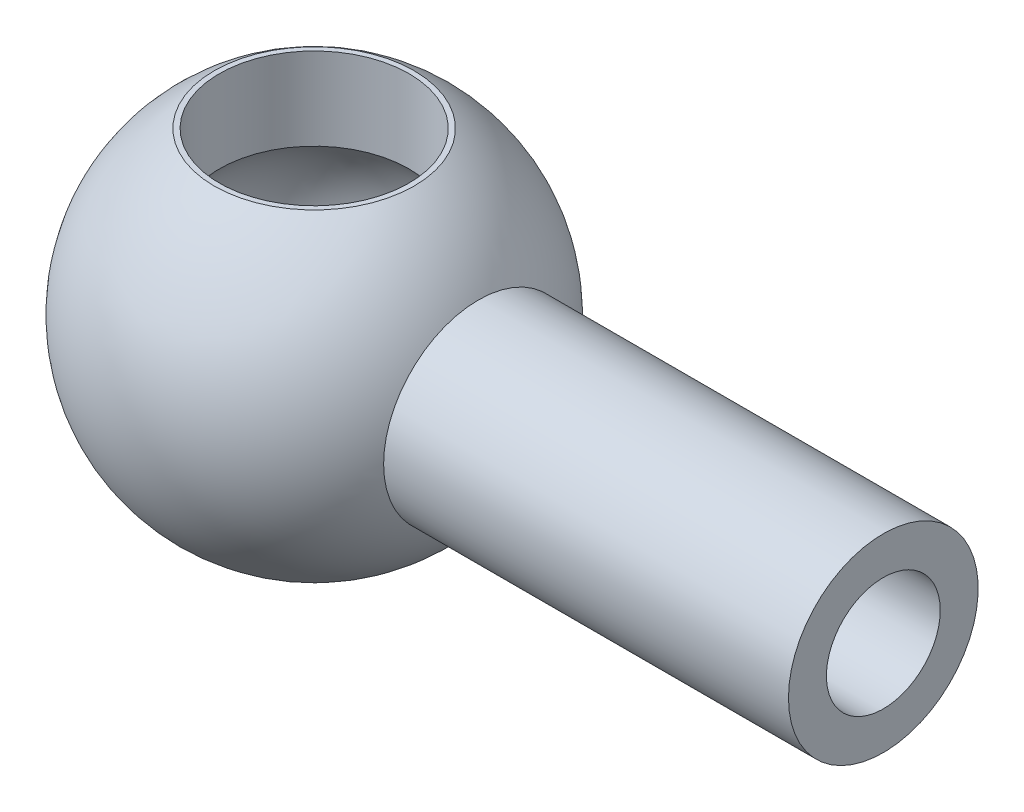
ISO-10303-21;
HEADER;
FILE_DESCRIPTION(('STEP AP214'),'2;1');
FILE_NAME('part.step','',(''),(''),'','','');
FILE_SCHEMA(('AUTOMOTIVE_DESIGN { 1 0 10303 214 1 1 1 1 }'));
ENDSEC;
DATA;
#1=APPLICATION_CONTEXT('core data for automotive mechanical design processes');
#2=APPLICATION_PROTOCOL_DEFINITION('international standard','automotive_design',2000,#1);
#3=PRODUCT_CONTEXT('',#1,'mechanical');
#4=PRODUCT('Part','Part','',(#3));
#5=PRODUCT_RELATED_PRODUCT_CATEGORY('part','',(#4));
#6=PRODUCT_DEFINITION_FORMATION('','',#4);
#7=PRODUCT_DEFINITION_CONTEXT('part definition',#1,'design');
#8=PRODUCT_DEFINITION('design','',#6,#7);
#9=PRODUCT_DEFINITION_SHAPE('','',#8);
#10=(LENGTH_UNIT() NAMED_UNIT(*) SI_UNIT(.MILLI.,.METRE.));
#11=(NAMED_UNIT(*) PLANE_ANGLE_UNIT() SI_UNIT($,.RADIAN.));
#12=(NAMED_UNIT(*) SI_UNIT($,.STERADIAN.) SOLID_ANGLE_UNIT());
#13=UNCERTAINTY_MEASURE_WITH_UNIT(LENGTH_MEASURE(1.E-05),#10,'distance_accuracy_value','');
#14=(GEOMETRIC_REPRESENTATION_CONTEXT(3) GLOBAL_UNCERTAINTY_ASSIGNED_CONTEXT((#13)) GLOBAL_UNIT_ASSIGNED_CONTEXT((#10,
#11,#12)) REPRESENTATION_CONTEXT('',''));
#15=CARTESIAN_POINT('',(0.,0.,0.));
#16=DIRECTION('',(0.,0.,1.));
#17=DIRECTION('',(1.,0.,0.));
#18=AXIS2_PLACEMENT_3D('',#15,#16,#17);
#19=CARTESIAN_POINT('',(-13.1157323700225,0.,0.));
#20=DIRECTION('',(-1.,0.,0.));
#21=DIRECTION('',(0.,0.,1.));
#22=AXIS2_PLACEMENT_3D('',#19,#20,#21);
#23=CYLINDRICAL_SURFACE('',#22,5.);
#24=CARTESIAN_POINT('',(30.,0.,0.));
#25=DIRECTION('',(-1.,0.,0.));
#26=DIRECTION('',(0.,0.,1.));
#27=AXIS2_PLACEMENT_3D('',#24,#25,#26);
#28=CIRCLE('',#27,5.);
#29=CARTESIAN_POINT('',(30.,0.,5.));
#30=VERTEX_POINT('',#29);
#31=EDGE_CURVE('E11',#30,#30,#28,.T.);
#32=ORIENTED_EDGE('',*,*,#31,.T.);
#33=EDGE_LOOP('',(#32));
#34=FACE_BOUND('',#33,.T.);
#35=CARTESIAN_POINT('',(8.66025403784439,0.,0.));
#36=DIRECTION('',(-1.,0.,0.));
#37=DIRECTION('',(0.,0.,1.));
#38=AXIS2_PLACEMENT_3D('',#35,#36,#37);
#39=CIRCLE('',#38,5.);
#40=CARTESIAN_POINT('',(8.66025403784439,0.,5.));
#41=VERTEX_POINT('',#40);
#42=EDGE_CURVE('E85',#41,#41,#39,.T.);
#43=ORIENTED_EDGE('',*,*,#42,.F.);
#44=EDGE_LOOP('',(#43));
#45=FACE_BOUND('',#44,.T.);
#46=ADVANCED_FACE('F78',(#34,#45),#23,.T.);
#47=CARTESIAN_POINT('',(30.,-5.,0.));
#48=DIRECTION('',(1.,0.,0.));
#49=DIRECTION('',(0.,0.,-1.));
#50=AXIS2_PLACEMENT_3D('',#47,#48,#49);
#51=PLANE('',#50);
#52=CARTESIAN_POINT('',(30.,0.,0.));
#53=DIRECTION('',(1.,0.,0.));
#54=DIRECTION('',(0.,0.,-1.));
#55=AXIS2_PLACEMENT_3D('',#52,#53,#54);
#56=CIRCLE('',#55,3.);
#57=CARTESIAN_POINT('',(30.,0.,-3.));
#58=VERTEX_POINT('',#57);
#59=EDGE_CURVE('E100',#58,#58,#56,.T.);
#60=ORIENTED_EDGE('',*,*,#59,.F.);
#61=EDGE_LOOP('',(#60));
#62=FACE_BOUND('',#61,.T.);
#63=ORIENTED_EDGE('',*,*,#31,.F.);
#64=EDGE_LOOP('',(#63));
#65=FACE_BOUND('',#64,.T.);
#66=ADVANCED_FACE('F120',(#62,#65),#51,.T.);
#67=CARTESIAN_POINT('',(0.,0.,0.));
#68=DIRECTION('',(-1.,0.,0.));
#69=DIRECTION('',(0.,1.,0.));
#70=AXIS2_PLACEMENT_3D('',#67,#68,#69);
#71=SPHERICAL_SURFACE('',#70,10.);
#72=CARTESIAN_POINT('',(0.,8.5,0.));
#73=DIRECTION('',(0.,-1.,0.));
#74=DIRECTION('',(0.,0.,-1.));
#75=AXIS2_PLACEMENT_3D('',#72,#73,#74);
#76=CIRCLE('',#75,5.26782687642637);
#77=CARTESIAN_POINT('',(0.,8.5,-5.26782687642637));
#78=VERTEX_POINT('',#77);
#79=EDGE_CURVE('E103',#78,#78,#76,.F.);
#80=ORIENTED_EDGE('',*,*,#79,.F.);
#81=EDGE_LOOP('',(#80));
#82=FACE_BOUND('',#81,.T.);
#83=CARTESIAN_POINT('',(0.,-8.5,0.));
#84=DIRECTION('',(0.,1.,0.));
#85=DIRECTION('',(0.,0.,1.));
#86=AXIS2_PLACEMENT_3D('',#83,#84,#85);
#87=CIRCLE('',#86,5.26782687642637);
#88=CARTESIAN_POINT('',(0.,-8.5,5.26782687642637));
#89=VERTEX_POINT('',#88);
#90=EDGE_CURVE('E98',#89,#89,#87,.F.);
#91=ORIENTED_EDGE('',*,*,#90,.F.);
#92=EDGE_LOOP('',(#91));
#93=FACE_BOUND('',#92,.T.);
#94=ORIENTED_EDGE('',*,*,#42,.T.);
#95=EDGE_LOOP('',(#94));
#96=FACE_BOUND('',#95,.T.);
#97=ADVANCED_FACE('F123',(#82,#93,#96),#71,.T.);
#98=CARTESIAN_POINT('',(20.,0.,0.));
#99=DIRECTION('',(1.,0.,0.));
#100=DIRECTION('',(0.,0.,-1.));
#101=AXIS2_PLACEMENT_3D('',#98,#99,#100);
#102=CYLINDRICAL_SURFACE('',#101,3.);
#103=CARTESIAN_POINT('',(20.,0.,0.));
#104=DIRECTION('',(1.,0.,0.));
#105=DIRECTION('',(0.,0.,-1.));
#106=AXIS2_PLACEMENT_3D('',#103,#104,#105);
#107=CIRCLE('',#106,3.);
#108=CARTESIAN_POINT('',(20.,0.,-3.));
#109=VERTEX_POINT('',#108);
#110=EDGE_CURVE('E90',#109,#109,#107,.T.);
#111=ORIENTED_EDGE('',*,*,#110,.F.);
#112=EDGE_LOOP('',(#111));
#113=FACE_BOUND('',#112,.T.);
#114=ORIENTED_EDGE('',*,*,#59,.T.);
#115=EDGE_LOOP('',(#114));
#116=FACE_BOUND('',#115,.T.);
#117=ADVANCED_FACE('F118',(#113,#116),#102,.F.);
#118=CARTESIAN_POINT('',(20.,0.,0.));
#119=DIRECTION('',(1.,0.,0.));
#120=DIRECTION('',(0.,0.,-1.));
#121=AXIS2_PLACEMENT_3D('',#118,#119,#120);
#122=PLANE('',#121);
#123=ORIENTED_EDGE('',*,*,#110,.T.);
#124=EDGE_LOOP('',(#123));
#125=FACE_BOUND('',#124,.T.);
#126=ADVANCED_FACE('F133',(#125),#122,.T.);
#127=CARTESIAN_POINT('',(10.,8.5,12.5));
#128=DIRECTION('',(0.,-1.,0.));
#129=DIRECTION('',(0.,0.,-1.));
#130=AXIS2_PLACEMENT_3D('',#127,#128,#129);
#131=PLANE('',#130);
#132=ORIENTED_EDGE('',*,*,#79,.T.);
#133=EDGE_LOOP('',(#132));
#134=FACE_BOUND('',#133,.T.);
#135=CARTESIAN_POINT('',(0.,8.5,0.));
#136=DIRECTION('',(0.,-1.,0.));
#137=DIRECTION('',(0.,0.,-1.));
#138=AXIS2_PLACEMENT_3D('',#135,#136,#137);
#139=CIRCLE('',#138,5.);
#140=CARTESIAN_POINT('',(0.,8.5,-5.));
#141=VERTEX_POINT('',#140);
#142=EDGE_CURVE('E101',#141,#141,#139,.F.);
#143=ORIENTED_EDGE('',*,*,#142,.F.);
#144=EDGE_LOOP('',(#143));
#145=FACE_BOUND('',#144,.T.);
#146=ADVANCED_FACE('F137',(#134,#145),#131,.F.);
#147=CARTESIAN_POINT('',(10.,-8.5,12.5));
#148=DIRECTION('',(0.,1.,0.));
#149=DIRECTION('',(0.,0.,1.));
#150=AXIS2_PLACEMENT_3D('',#147,#148,#149);
#151=PLANE('',#150);
#152=ORIENTED_EDGE('',*,*,#90,.T.);
#153=EDGE_LOOP('',(#152));
#154=FACE_BOUND('',#153,.T.);
#155=CARTESIAN_POINT('',(0.,-8.5,0.));
#156=DIRECTION('',(0.,1.,0.));
#157=DIRECTION('',(0.,0.,1.));
#158=AXIS2_PLACEMENT_3D('',#155,#156,#157);
#159=CIRCLE('',#158,5.);
#160=CARTESIAN_POINT('',(0.,-8.5,5.));
#161=VERTEX_POINT('',#160);
#162=EDGE_CURVE('E81',#161,#161,#159,.F.);
#163=ORIENTED_EDGE('',*,*,#162,.F.);
#164=EDGE_LOOP('',(#163));
#165=FACE_BOUND('',#164,.T.);
#166=ADVANCED_FACE('F149',(#154,#165),#151,.F.);
#167=CARTESIAN_POINT('',(0.,-15.,0.));
#168=DIRECTION('',(0.,1.,0.));
#169=DIRECTION('',(0.,0.,1.));
#170=AXIS2_PLACEMENT_3D('',#167,#168,#169);
#171=CYLINDRICAL_SURFACE('',#170,5.);
#172=ORIENTED_EDGE('',*,*,#162,.T.);
#173=EDGE_LOOP('',(#172));
#174=FACE_BOUND('',#173,.T.);
#175=CARTESIAN_POINT('',(0.,-4.15331193145904,0.));
#176=DIRECTION('',(0.,1.,0.));
#177=DIRECTION('',(0.,0.,1.));
#178=AXIS2_PLACEMENT_3D('',#175,#176,#177);
#179=CIRCLE('',#178,5.);
#180=CARTESIAN_POINT('',(0.,-4.15331193145904,5.));
#181=VERTEX_POINT('',#180);
#182=EDGE_CURVE('E94',#181,#181,#179,.F.);
#183=ORIENTED_EDGE('',*,*,#182,.F.);
#184=EDGE_LOOP('',(#183));
#185=FACE_BOUND('',#184,.T.);
#186=ADVANCED_FACE('F143',(#174,#185),#171,.F.);
#187=CARTESIAN_POINT('',(0.,0.,0.));
#188=DIRECTION('',(-1.,0.,0.));
#189=DIRECTION('',(0.,1.,0.));
#190=AXIS2_PLACEMENT_3D('',#187,#188,#189);
#191=SPHERICAL_SURFACE('',#190,6.5);
#192=CARTESIAN_POINT('',(0.,0.,0.));
#193=DIRECTION('',(0.,-1.,0.));
#194=DIRECTION('',(0.,0.,-1.));
#195=AXIS2_PLACEMENT_3D('',#192,#193,#194);
#196=SPHERICAL_SURFACE('',#195,6.5);
#197=CARTESIAN_POINT('',(0.,4.15331193145904,0.));
#198=DIRECTION('',(0.,-1.,0.));
#199=DIRECTION('',(0.,0.,-1.));
#200=AXIS2_PLACEMENT_3D('',#197,#198,#199);
#201=CIRCLE('',#200,5.);
#202=CARTESIAN_POINT('',(0.,4.15331193145904,-5.));
#203=VERTEX_POINT('',#202);
#204=EDGE_CURVE('E97',#203,#203,#201,.F.);
#205=ORIENTED_EDGE('',*,*,#204,.T.);
#206=EDGE_LOOP('',(#205));
#207=FACE_BOUND('',#206,.T.);
#208=ORIENTED_EDGE('',*,*,#182,.T.);
#209=EDGE_LOOP('',(#208));
#210=FACE_BOUND('',#209,.T.);
#211=ADVANCED_FACE('F139',(#207,#210),#196,.F.);
#212=ORIENTED_EDGE('',*,*,#142,.T.);
#213=EDGE_LOOP('',(#212));
#214=FACE_BOUND('',#213,.T.);
#215=ORIENTED_EDGE('',*,*,#204,.F.);
#216=EDGE_LOOP('',(#215));
#217=FACE_BOUND('',#216,.T.);
#218=ADVANCED_FACE('F142',(#214,#217),#171,.F.);
#219=CLOSED_SHELL('',(#46,#66,#97,#117,#126,#146,#166,#186,#211,#218));
#220=MANIFOLD_SOLID_BREP('B2',#219);
#221=ADVANCED_BREP_SHAPE_REPRESENTATION('',(#18,#220),#14);
#222=SHAPE_DEFINITION_REPRESENTATION(#9,#221);
ENDSEC;
END-ISO-10303-21;
